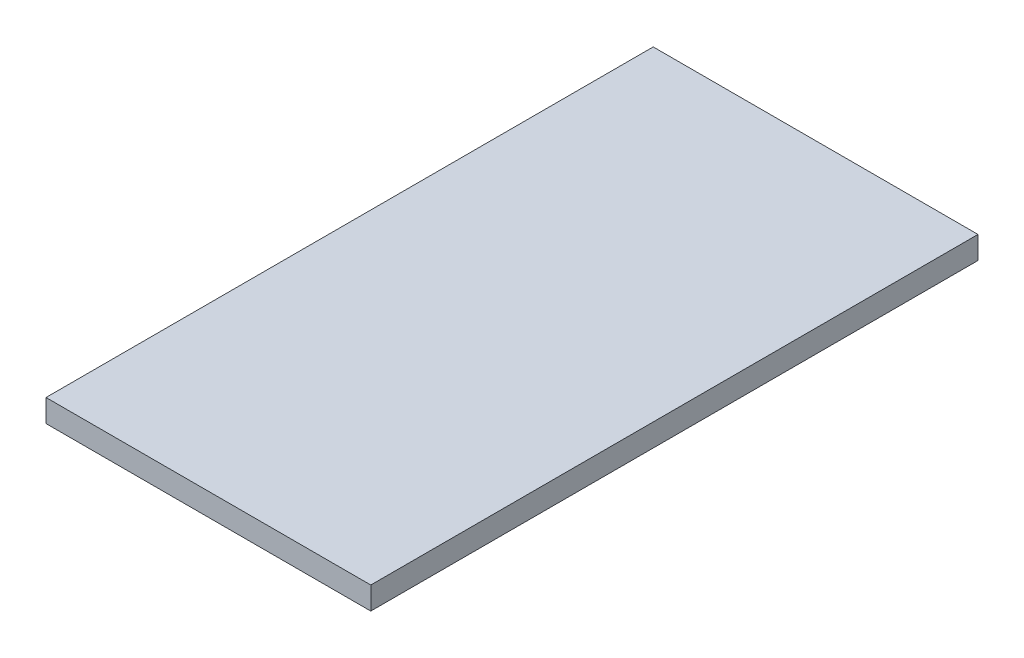
ISO-10303-21;
HEADER;
FILE_DESCRIPTION(('STEP AP214'),'2;1');
FILE_NAME('part.step','',(''),(''),'','','');
FILE_SCHEMA(('AUTOMOTIVE_DESIGN { 1 0 10303 214 1 1 1 1 }'));
ENDSEC;
DATA;
#1=APPLICATION_CONTEXT('core data for automotive mechanical design processes');
#2=APPLICATION_PROTOCOL_DEFINITION('international standard','automotive_design',2000,#1);
#3=PRODUCT_CONTEXT('',#1,'mechanical');
#4=PRODUCT('Part','Part','',(#3));
#5=PRODUCT_RELATED_PRODUCT_CATEGORY('part','',(#4));
#6=PRODUCT_DEFINITION_FORMATION('','',#4);
#7=PRODUCT_DEFINITION_CONTEXT('part definition',#1,'design');
#8=PRODUCT_DEFINITION('design','',#6,#7);
#9=PRODUCT_DEFINITION_SHAPE('','',#8);
#10=(LENGTH_UNIT() NAMED_UNIT(*) SI_UNIT(.MILLI.,.METRE.));
#11=(NAMED_UNIT(*) PLANE_ANGLE_UNIT() SI_UNIT($,.RADIAN.));
#12=(NAMED_UNIT(*) SI_UNIT($,.STERADIAN.) SOLID_ANGLE_UNIT());
#13=UNCERTAINTY_MEASURE_WITH_UNIT(LENGTH_MEASURE(1.E-05),#10,'distance_accuracy_value','');
#14=(GEOMETRIC_REPRESENTATION_CONTEXT(3) GLOBAL_UNCERTAINTY_ASSIGNED_CONTEXT((#13)) GLOBAL_UNIT_ASSIGNED_CONTEXT((#10,
#11,#12)) REPRESENTATION_CONTEXT('',''));
#15=CARTESIAN_POINT('',(0.,0.,0.));
#16=DIRECTION('',(0.,0.,1.));
#17=DIRECTION('',(1.,0.,0.));
#18=AXIS2_PLACEMENT_3D('',#15,#16,#17);
#19=CARTESIAN_POINT('',(-11.5,1.6,-21.5));
#20=DIRECTION('',(1.,0.,0.));
#21=DIRECTION('',(0.,0.,-1.));
#22=AXIS2_PLACEMENT_3D('',#19,#20,#21);
#23=PLANE('',#22);
#24=DIRECTION('',(0.,0.,1.));
#25=VECTOR('',#24,1.);
#26=CARTESIAN_POINT('',(-11.5,0.,-21.5));
#27=LINE('',#26,#25);
#28=CARTESIAN_POINT('',(-11.5,0.,-21.5));
#29=VERTEX_POINT('',#28);
#30=CARTESIAN_POINT('',(-11.5,0.,21.5));
#31=VERTEX_POINT('',#30);
#32=EDGE_CURVE('E97',#29,#31,#27,.T.);
#33=ORIENTED_EDGE('',*,*,#32,.T.);
#34=DIRECTION('',(0.,-1.,0.));
#35=VECTOR('',#34,1.);
#36=CARTESIAN_POINT('',(-11.5,1.6,21.5));
#37=LINE('',#36,#35);
#38=CARTESIAN_POINT('',(-11.5,1.6,21.5));
#39=VERTEX_POINT('',#38);
#40=EDGE_CURVE('E11',#39,#31,#37,.T.);
#41=ORIENTED_EDGE('',*,*,#40,.F.);
#42=DIRECTION('',(0.,0.,1.));
#43=VECTOR('',#42,1.);
#44=CARTESIAN_POINT('',(-11.5,1.6,-21.5));
#45=LINE('',#44,#43);
#46=CARTESIAN_POINT('',(-11.5,1.6,-21.5));
#47=VERTEX_POINT('',#46);
#48=EDGE_CURVE('E85',#47,#39,#45,.T.);
#49=ORIENTED_EDGE('',*,*,#48,.F.);
#50=DIRECTION('',(0.,-1.,0.));
#51=VECTOR('',#50,1.);
#52=CARTESIAN_POINT('',(-11.5,1.6,-21.5));
#53=LINE('',#52,#51);
#54=EDGE_CURVE('E93',#47,#29,#53,.T.);
#55=ORIENTED_EDGE('',*,*,#54,.T.);
#56=EDGE_LOOP('',(#33,#41,#49,#55));
#57=FACE_BOUND('',#56,.T.);
#58=ADVANCED_FACE('F34',(#57),#23,.F.);
#59=CARTESIAN_POINT('',(-11.5,1.6,21.5));
#60=DIRECTION('',(0.,0.,-1.));
#61=DIRECTION('',(-1.,0.,0.));
#62=AXIS2_PLACEMENT_3D('',#59,#60,#61);
#63=PLANE('',#62);
#64=DIRECTION('',(1.,0.,0.));
#65=VECTOR('',#64,1.);
#66=CARTESIAN_POINT('',(-11.5,0.,21.5));
#67=LINE('',#66,#65);
#68=CARTESIAN_POINT('',(11.5,0.,21.5));
#69=VERTEX_POINT('',#68);
#70=EDGE_CURVE('E89',#31,#69,#67,.T.);
#71=ORIENTED_EDGE('',*,*,#70,.T.);
#72=DIRECTION('',(0.,-1.,0.));
#73=VECTOR('',#72,1.);
#74=CARTESIAN_POINT('',(11.5,1.6,21.5));
#75=LINE('',#74,#73);
#76=CARTESIAN_POINT('',(11.5,1.6,21.5));
#77=VERTEX_POINT('',#76);
#78=EDGE_CURVE('E42',#77,#69,#75,.T.);
#79=ORIENTED_EDGE('',*,*,#78,.F.);
#80=DIRECTION('',(1.,0.,0.));
#81=VECTOR('',#80,1.);
#82=CARTESIAN_POINT('',(-11.5,1.6,21.5));
#83=LINE('',#82,#81);
#84=EDGE_CURVE('E80',#39,#77,#83,.T.);
#85=ORIENTED_EDGE('',*,*,#84,.F.);
#86=ORIENTED_EDGE('',*,*,#40,.T.);
#87=EDGE_LOOP('',(#71,#79,#85,#86));
#88=FACE_BOUND('',#87,.T.);
#89=ADVANCED_FACE('F88',(#88),#63,.F.);
#90=CARTESIAN_POINT('',(11.5,1.6,-21.5));
#91=DIRECTION('',(-1.,0.,0.));
#92=DIRECTION('',(0.,0.,1.));
#93=AXIS2_PLACEMENT_3D('',#90,#91,#92);
#94=PLANE('',#93);
#95=DIRECTION('',(0.,0.,-1.));
#96=VECTOR('',#95,1.);
#97=CARTESIAN_POINT('',(11.5,0.,-21.5));
#98=LINE('',#97,#96);
#99=CARTESIAN_POINT('',(11.5,0.,-21.5));
#100=VERTEX_POINT('',#99);
#101=EDGE_CURVE('E67',#69,#100,#98,.T.);
#102=ORIENTED_EDGE('',*,*,#101,.T.);
#103=DIRECTION('',(0.,-1.,0.));
#104=VECTOR('',#103,1.);
#105=CARTESIAN_POINT('',(11.5,1.6,-21.5));
#106=LINE('',#105,#104);
#107=CARTESIAN_POINT('',(11.5,1.6,-21.5));
#108=VERTEX_POINT('',#107);
#109=EDGE_CURVE('E90',#108,#100,#106,.T.);
#110=ORIENTED_EDGE('',*,*,#109,.F.);
#111=DIRECTION('',(0.,0.,-1.));
#112=VECTOR('',#111,1.);
#113=CARTESIAN_POINT('',(11.5,1.6,-21.5));
#114=LINE('',#113,#112);
#115=EDGE_CURVE('E83',#77,#108,#114,.T.);
#116=ORIENTED_EDGE('',*,*,#115,.F.);
#117=ORIENTED_EDGE('',*,*,#78,.T.);
#118=EDGE_LOOP('',(#102,#110,#116,#117));
#119=FACE_BOUND('',#118,.T.);
#120=ADVANCED_FACE('F91',(#119),#94,.F.);
#121=CARTESIAN_POINT('',(-11.5,1.6,-21.5));
#122=DIRECTION('',(0.,0.,1.));
#123=DIRECTION('',(1.,0.,0.));
#124=AXIS2_PLACEMENT_3D('',#121,#122,#123);
#125=PLANE('',#124);
#126=DIRECTION('',(-1.,0.,0.));
#127=VECTOR('',#126,1.);
#128=CARTESIAN_POINT('',(-11.5,0.,-21.5));
#129=LINE('',#128,#127);
#130=EDGE_CURVE('E73',#100,#29,#129,.T.);
#131=ORIENTED_EDGE('',*,*,#130,.T.);
#132=ORIENTED_EDGE('',*,*,#54,.F.);
#133=DIRECTION('',(-1.,0.,0.));
#134=VECTOR('',#133,1.);
#135=CARTESIAN_POINT('',(-11.5,1.6,-21.5));
#136=LINE('',#135,#134);
#137=EDGE_CURVE('E50',#108,#47,#136,.T.);
#138=ORIENTED_EDGE('',*,*,#137,.F.);
#139=ORIENTED_EDGE('',*,*,#109,.T.);
#140=EDGE_LOOP('',(#131,#132,#138,#139));
#141=FACE_BOUND('',#140,.T.);
#142=ADVANCED_FACE('F104',(#141),#125,.F.);
#143=CARTESIAN_POINT('',(0.,1.6,0.));
#144=DIRECTION('',(0.,1.,0.));
#145=DIRECTION('',(0.,0.,1.));
#146=AXIS2_PLACEMENT_3D('',#143,#144,#145);
#147=PLANE('',#146);
#148=ORIENTED_EDGE('',*,*,#48,.T.);
#149=ORIENTED_EDGE('',*,*,#84,.T.);
#150=ORIENTED_EDGE('',*,*,#115,.T.);
#151=ORIENTED_EDGE('',*,*,#137,.T.);
#152=EDGE_LOOP('',(#148,#149,#150,#151));
#153=FACE_BOUND('',#152,.T.);
#154=ADVANCED_FACE('F81',(#153),#147,.T.);
#155=CARTESIAN_POINT('',(0.,0.,0.));
#156=DIRECTION('',(0.,1.,0.));
#157=DIRECTION('',(0.,0.,1.));
#158=AXIS2_PLACEMENT_3D('',#155,#156,#157);
#159=PLANE('',#158);
#160=ORIENTED_EDGE('',*,*,#32,.F.);
#161=ORIENTED_EDGE('',*,*,#130,.F.);
#162=ORIENTED_EDGE('',*,*,#101,.F.);
#163=ORIENTED_EDGE('',*,*,#70,.F.);
#164=EDGE_LOOP('',(#160,#161,#162,#163));
#165=FACE_BOUND('',#164,.T.);
#166=ADVANCED_FACE('F107',(#165),#159,.F.);
#167=CLOSED_SHELL('',(#58,#89,#120,#142,#154,#166));
#168=MANIFOLD_SOLID_BREP('B2',#167);
#169=ADVANCED_BREP_SHAPE_REPRESENTATION('',(#18,#168),#14);
#170=SHAPE_DEFINITION_REPRESENTATION(#9,#169);
ENDSEC;
END-ISO-10303-21;
